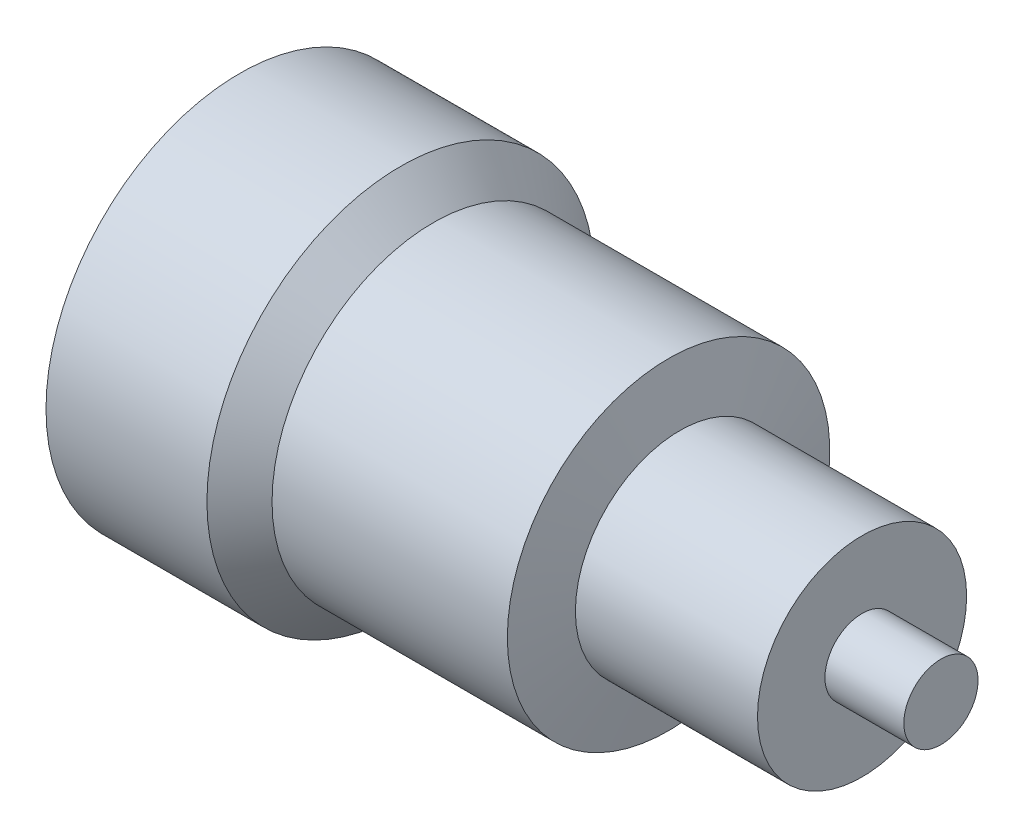
ISO-10303-21;
HEADER;
FILE_DESCRIPTION(('STEP AP214'),'2;1');
FILE_NAME('part.step','',(''),(''),'','','');
FILE_SCHEMA(('AUTOMOTIVE_DESIGN { 1 0 10303 214 1 1 1 1 }'));
ENDSEC;
DATA;
#1=APPLICATION_CONTEXT('core data for automotive mechanical design processes');
#2=APPLICATION_PROTOCOL_DEFINITION('international standard','automotive_design',2000,#1);
#3=PRODUCT_CONTEXT('',#1,'mechanical');
#4=PRODUCT('Part','Part','',(#3));
#5=PRODUCT_RELATED_PRODUCT_CATEGORY('part','',(#4));
#6=PRODUCT_DEFINITION_FORMATION('','',#4);
#7=PRODUCT_DEFINITION_CONTEXT('part definition',#1,'design');
#8=PRODUCT_DEFINITION('design','',#6,#7);
#9=PRODUCT_DEFINITION_SHAPE('','',#8);
#10=(LENGTH_UNIT() NAMED_UNIT(*) SI_UNIT(.MILLI.,.METRE.));
#11=(NAMED_UNIT(*) PLANE_ANGLE_UNIT() SI_UNIT($,.RADIAN.));
#12=(NAMED_UNIT(*) SI_UNIT($,.STERADIAN.) SOLID_ANGLE_UNIT());
#13=UNCERTAINTY_MEASURE_WITH_UNIT(LENGTH_MEASURE(1.E-05),#10,'distance_accuracy_value','');
#14=(GEOMETRIC_REPRESENTATION_CONTEXT(3) GLOBAL_UNCERTAINTY_ASSIGNED_CONTEXT((#13)) GLOBAL_UNIT_ASSIGNED_CONTEXT((#10,
#11,#12)) REPRESENTATION_CONTEXT('',''));
#15=CARTESIAN_POINT('',(0.,0.,0.));
#16=DIRECTION('',(0.,0.,1.));
#17=DIRECTION('',(1.,0.,0.));
#18=AXIS2_PLACEMENT_3D('',#15,#16,#17);
#19=CARTESIAN_POINT('',(86.9726420670438,0.,0.));
#20=DIRECTION('',(1.,0.,0.));
#21=DIRECTION('',(0.,0.,-1.));
#22=AXIS2_PLACEMENT_3D('',#19,#20,#21);
#23=PLANE('',#22);
#24=CARTESIAN_POINT('',(86.9726420670438,0.,0.));
#25=DIRECTION('',(-1.,0.,0.));
#26=DIRECTION('',(0.,0.,1.));
#27=AXIS2_PLACEMENT_3D('',#24,#25,#26);
#28=CIRCLE('',#27,4.60437263755153);
#29=CARTESIAN_POINT('',(86.9726420670438,0.,4.60437263755153));
#30=VERTEX_POINT('',#29);
#31=EDGE_CURVE('E11',#30,#30,#28,.T.);
#32=ORIENTED_EDGE('',*,*,#31,.F.);
#33=EDGE_LOOP('',(#32));
#34=FACE_BOUND('',#33,.T.);
#35=ADVANCED_FACE('F37',(#34),#23,.T.);
#36=CARTESIAN_POINT('',(0.,0.,0.));
#37=DIRECTION('',(-1.,0.,0.));
#38=DIRECTION('',(0.,0.,1.));
#39=AXIS2_PLACEMENT_3D('',#36,#37,#38);
#40=CYLINDRICAL_SURFACE('',#39,4.60437263755153);
#41=CARTESIAN_POINT('',(77.1872887037537,0.,0.));
#42=DIRECTION('',(-1.,0.,0.));
#43=DIRECTION('',(0.,0.,1.));
#44=AXIS2_PLACEMENT_3D('',#41,#42,#43);
#45=CIRCLE('',#44,4.60437263755153);
#46=CARTESIAN_POINT('',(77.1872887037537,0.,4.60437263755153));
#47=VERTEX_POINT('',#46);
#48=EDGE_CURVE('E43',#47,#47,#45,.T.);
#49=ORIENTED_EDGE('',*,*,#48,.F.);
#50=EDGE_LOOP('',(#49));
#51=FACE_BOUND('',#50,.T.);
#52=ORIENTED_EDGE('',*,*,#31,.T.);
#53=EDGE_LOOP('',(#52));
#54=FACE_BOUND('',#53,.T.);
#55=ADVANCED_FACE('F83',(#51,#54),#40,.T.);
#56=CARTESIAN_POINT('',(77.1872887037537,0.,0.));
#57=DIRECTION('',(1.,0.,0.));
#58=DIRECTION('',(0.,0.,-1.));
#59=AXIS2_PLACEMENT_3D('',#56,#57,#58);
#60=PLANE('',#59);
#61=ORIENTED_EDGE('',*,*,#48,.T.);
#62=EDGE_LOOP('',(#61));
#63=FACE_BOUND('',#62,.T.);
#64=CARTESIAN_POINT('',(77.1872887037537,0.,0.));
#65=DIRECTION('',(-1.,0.,0.));
#66=DIRECTION('',(0.,0.,1.));
#67=AXIS2_PLACEMENT_3D('',#64,#65,#66);
#68=CIRCLE('',#67,12.9711002522797);
#69=CARTESIAN_POINT('',(77.1872887037537,0.,12.9711002522797));
#70=VERTEX_POINT('',#69);
#71=EDGE_CURVE('E75',#70,#70,#68,.T.);
#72=ORIENTED_EDGE('',*,*,#71,.F.);
#73=EDGE_LOOP('',(#72));
#74=FACE_BOUND('',#73,.T.);
#75=ADVANCED_FACE('F80',(#63,#74),#60,.T.);
#76=CARTESIAN_POINT('',(0.,0.,0.));
#77=DIRECTION('',(-1.,0.,0.));
#78=DIRECTION('',(0.,0.,1.));
#79=AXIS2_PLACEMENT_3D('',#76,#77,#78);
#80=CYLINDRICAL_SURFACE('',#79,12.9711002522797);
#81=ORIENTED_EDGE('',*,*,#71,.T.);
#82=EDGE_LOOP('',(#81));
#83=FACE_BOUND('',#82,.T.);
#84=CARTESIAN_POINT('',(54.5983726267887,0.,0.));
#85=DIRECTION('',(-1.,0.,0.));
#86=DIRECTION('',(0.,0.,1.));
#87=AXIS2_PLACEMENT_3D('',#84,#85,#86);
#88=CIRCLE('',#87,12.9711002522797);
#89=CARTESIAN_POINT('',(54.5983726267887,0.,12.9711002522797));
#90=VERTEX_POINT('',#89);
#91=EDGE_CURVE('E72',#90,#90,#88,.T.);
#92=ORIENTED_EDGE('',*,*,#91,.F.);
#93=EDGE_LOOP('',(#92));
#94=FACE_BOUND('',#93,.T.);
#95=ADVANCED_FACE('F101',(#83,#94),#80,.T.);
#96=CARTESIAN_POINT('',(53.1872887037537,0.,0.));
#97=DIRECTION('',(-1.,0.,0.));
#98=DIRECTION('',(0.,0.,1.));
#99=AXIS2_PLACEMENT_3D('',#96,#97,#98);
#100=CONICAL_SURFACE('',#99,20.,1.37267530011146);
#101=ORIENTED_EDGE('',*,*,#91,.T.);
#102=EDGE_LOOP('',(#101));
#103=FACE_BOUND('',#102,.T.);
#104=CARTESIAN_POINT('',(53.1872887037537,0.,0.));
#105=DIRECTION('',(-1.,0.,0.));
#106=DIRECTION('',(0.,0.,1.));
#107=AXIS2_PLACEMENT_3D('',#104,#105,#106);
#108=CIRCLE('',#107,20.);
#109=CARTESIAN_POINT('',(53.1872887037537,0.,20.));
#110=VERTEX_POINT('',#109);
#111=EDGE_CURVE('E69',#110,#110,#108,.T.);
#112=ORIENTED_EDGE('',*,*,#111,.F.);
#113=EDGE_LOOP('',(#112));
#114=FACE_BOUND('',#113,.T.);
#115=ADVANCED_FACE('F109',(#103,#114),#100,.T.);
#116=CARTESIAN_POINT('',(0.,0.,0.));
#117=DIRECTION('',(-1.,0.,0.));
#118=DIRECTION('',(0.,0.,1.));
#119=AXIS2_PLACEMENT_3D('',#116,#117,#118);
#120=CYLINDRICAL_SURFACE('',#119,20.);
#121=ORIENTED_EDGE('',*,*,#111,.T.);
#122=EDGE_LOOP('',(#121));
#123=FACE_BOUND('',#122,.T.);
#124=CARTESIAN_POINT('',(24.,0.,0.));
#125=DIRECTION('',(-1.,0.,0.));
#126=DIRECTION('',(0.,0.,1.));
#127=AXIS2_PLACEMENT_3D('',#124,#125,#126);
#128=CIRCLE('',#127,20.);
#129=CARTESIAN_POINT('',(24.,0.,20.));
#130=VERTEX_POINT('',#129);
#131=EDGE_CURVE('E66',#130,#130,#128,.T.);
#132=ORIENTED_EDGE('',*,*,#131,.F.);
#133=EDGE_LOOP('',(#132));
#134=FACE_BOUND('',#133,.T.);
#135=ADVANCED_FACE('F116',(#123,#134),#120,.T.);
#136=CARTESIAN_POINT('',(19.9615384615385,0.,0.));
#137=DIRECTION('',(-1.,0.,0.));
#138=DIRECTION('',(0.,0.,1.));
#139=AXIS2_PLACEMENT_3D('',#136,#137,#138);
#140=CONICAL_SURFACE('',#139,24.0384615384615,0.785398163397449);
#141=ORIENTED_EDGE('',*,*,#131,.T.);
#142=EDGE_LOOP('',(#141));
#143=FACE_BOUND('',#142,.T.);
#144=CARTESIAN_POINT('',(19.9615384615385,0.,0.));
#145=DIRECTION('',(-1.,0.,0.));
#146=DIRECTION('',(0.,0.,1.));
#147=AXIS2_PLACEMENT_3D('',#144,#145,#146);
#148=CIRCLE('',#147,24.0384615384615);
#149=CARTESIAN_POINT('',(19.9615384615385,0.,24.0384615384615));
#150=VERTEX_POINT('',#149);
#151=EDGE_CURVE('E63',#150,#150,#148,.T.);
#152=ORIENTED_EDGE('',*,*,#151,.F.);
#153=EDGE_LOOP('',(#152));
#154=FACE_BOUND('',#153,.T.);
#155=ADVANCED_FACE('F124',(#143,#154),#140,.T.);
#156=CARTESIAN_POINT('',(0.,0.,0.));
#157=DIRECTION('',(-1.,0.,0.));
#158=DIRECTION('',(0.,0.,1.));
#159=AXIS2_PLACEMENT_3D('',#156,#157,#158);
#160=CYLINDRICAL_SURFACE('',#159,24.0384615384615);
#161=ORIENTED_EDGE('',*,*,#151,.T.);
#162=EDGE_LOOP('',(#161));
#163=FACE_BOUND('',#162,.T.);
#164=CARTESIAN_POINT('',(0.,0.,0.));
#165=DIRECTION('',(-1.,0.,0.));
#166=DIRECTION('',(0.,0.,1.));
#167=AXIS2_PLACEMENT_3D('',#164,#165,#166);
#168=CIRCLE('',#167,24.0384615384615);
#169=CARTESIAN_POINT('',(0.,0.,24.0384615384615));
#170=VERTEX_POINT('',#169);
#171=EDGE_CURVE('E58',#170,#170,#168,.T.);
#172=ORIENTED_EDGE('',*,*,#171,.F.);
#173=EDGE_LOOP('',(#172));
#174=FACE_BOUND('',#173,.T.);
#175=ADVANCED_FACE('F132',(#163,#174),#160,.T.);
#176=CARTESIAN_POINT('',(0.,0.,0.));
#177=DIRECTION('',(1.,0.,0.));
#178=DIRECTION('',(0.,0.,-1.));
#179=AXIS2_PLACEMENT_3D('',#176,#177,#178);
#180=PLANE('',#179);
#181=CARTESIAN_POINT('',(0.,0.,0.));
#182=DIRECTION('',(-1.,0.,0.));
#183=DIRECTION('',(0.,0.,1.));
#184=AXIS2_PLACEMENT_3D('',#181,#182,#183);
#185=CIRCLE('',#184,20.);
#186=CARTESIAN_POINT('',(0.,0.,20.));
#187=VERTEX_POINT('',#186);
#188=EDGE_CURVE('E55',#187,#187,#185,.T.);
#189=ORIENTED_EDGE('',*,*,#188,.F.);
#190=EDGE_LOOP('',(#189));
#191=FACE_BOUND('',#190,.T.);
#192=ORIENTED_EDGE('',*,*,#171,.T.);
#193=EDGE_LOOP('',(#192));
#194=FACE_BOUND('',#193,.T.);
#195=ADVANCED_FACE('F140',(#191,#194),#180,.F.);
#196=CARTESIAN_POINT('',(0.,0.,0.));
#197=DIRECTION('',(-1.,0.,0.));
#198=DIRECTION('',(0.,0.,1.));
#199=AXIS2_PLACEMENT_3D('',#196,#197,#198);
#200=CYLINDRICAL_SURFACE('',#199,20.);
#201=CARTESIAN_POINT('',(19.4989879447576,0.,0.));
#202=DIRECTION('',(-1.,0.,0.));
#203=DIRECTION('',(0.,0.,1.));
#204=AXIS2_PLACEMENT_3D('',#201,#202,#203);
#205=CIRCLE('',#204,20.);
#206=CARTESIAN_POINT('',(19.4989879447576,0.,20.));
#207=VERTEX_POINT('',#206);
#208=EDGE_CURVE('E53',#207,#207,#205,.T.);
#209=ORIENTED_EDGE('',*,*,#208,.F.);
#210=EDGE_LOOP('',(#209));
#211=FACE_BOUND('',#210,.T.);
#212=ORIENTED_EDGE('',*,*,#188,.T.);
#213=EDGE_LOOP('',(#212));
#214=FACE_BOUND('',#213,.T.);
#215=ADVANCED_FACE('F49',(#211,#214),#200,.F.);
#216=CARTESIAN_POINT('',(19.4989879447576,0.,0.));
#217=DIRECTION('',(-1.,0.,0.));
#218=DIRECTION('',(0.,0.,1.));
#219=AXIS2_PLACEMENT_3D('',#216,#217,#218);
#220=CONICAL_SURFACE('',#219,20.,0.922144171140605);
#221=CARTESIAN_POINT('',(34.6605838795647,0.,0.));
#222=VERTEX_POINT('',#221);
#223=VERTEX_LOOP('',#222);
#224=FACE_BOUND('',#223,.T.);
#225=ORIENTED_EDGE('',*,*,#208,.T.);
#226=EDGE_LOOP('',(#225));
#227=FACE_BOUND('',#226,.T.);
#228=ADVANCED_FACE('F46',(#224,#227),#220,.F.);
#229=CLOSED_SHELL('',(#35,#55,#75,#95,#115,#135,#155,#175,#195,#215,#228));
#230=MANIFOLD_SOLID_BREP('B2',#229);
#231=ADVANCED_BREP_SHAPE_REPRESENTATION('',(#18,#230),#14);
#232=SHAPE_DEFINITION_REPRESENTATION(#9,#231);
ENDSEC;
END-ISO-10303-21;
